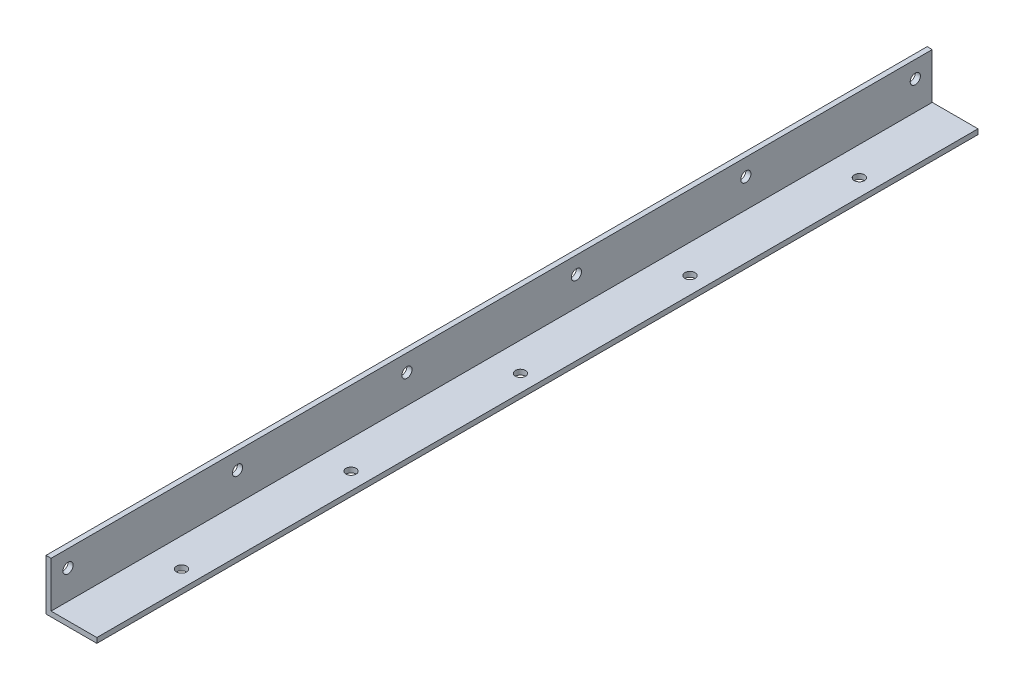
ISO-10303-21;
HEADER;
FILE_DESCRIPTION(('STEP AP214'),'2;1');
FILE_NAME('part.step','',(''),(''),'','','');
FILE_SCHEMA(('AUTOMOTIVE_DESIGN { 1 0 10303 214 1 1 1 1 }'));
ENDSEC;
DATA;
#1=APPLICATION_CONTEXT('core data for automotive mechanical design processes');
#2=APPLICATION_PROTOCOL_DEFINITION('international standard','automotive_design',2000,#1);
#3=PRODUCT_CONTEXT('',#1,'mechanical');
#4=PRODUCT('Part','Part','',(#3));
#5=PRODUCT_RELATED_PRODUCT_CATEGORY('part','',(#4));
#6=PRODUCT_DEFINITION_FORMATION('','',#4);
#7=PRODUCT_DEFINITION_CONTEXT('part definition',#1,'design');
#8=PRODUCT_DEFINITION('design','',#6,#7);
#9=PRODUCT_DEFINITION_SHAPE('','',#8);
#10=(LENGTH_UNIT() NAMED_UNIT(*) SI_UNIT(.MILLI.,.METRE.));
#11=(NAMED_UNIT(*) PLANE_ANGLE_UNIT() SI_UNIT($,.RADIAN.));
#12=(NAMED_UNIT(*) SI_UNIT($,.STERADIAN.) SOLID_ANGLE_UNIT());
#13=UNCERTAINTY_MEASURE_WITH_UNIT(LENGTH_MEASURE(1.E-05),#10,'distance_accuracy_value','');
#14=(GEOMETRIC_REPRESENTATION_CONTEXT(3) GLOBAL_UNCERTAINTY_ASSIGNED_CONTEXT((#13)) GLOBAL_UNIT_ASSIGNED_CONTEXT((#10,
#11,#12)) REPRESENTATION_CONTEXT('',''));
#15=CARTESIAN_POINT('',(0.,0.,0.));
#16=DIRECTION('',(0.,0.,1.));
#17=DIRECTION('',(1.,0.,0.));
#18=AXIS2_PLACEMENT_3D('',#15,#16,#17);
#19=CARTESIAN_POINT('',(0.,0.,260.));
#20=DIRECTION('',(1.,0.,0.));
#21=DIRECTION('',(0.,0.,-1.));
#22=AXIS2_PLACEMENT_3D('',#19,#20,#21);
#23=PLANE('',#22);
#24=CARTESIAN_POINT('',(0.,10.,55.));
#25=DIRECTION('',(-1.,0.,0.));
#26=DIRECTION('',(0.,0.,1.));
#27=AXIS2_PLACEMENT_3D('',#24,#25,#26);
#28=CIRCLE('',#27,1.5);
#29=CARTESIAN_POINT('',(0.,10.,56.5));
#30=VERTEX_POINT('',#29);
#31=EDGE_CURVE('E170',#30,#30,#28,.T.);
#32=ORIENTED_EDGE('',*,*,#31,.F.);
#33=EDGE_LOOP('',(#32));
#34=FACE_BOUND('',#33,.T.);
#35=CARTESIAN_POINT('',(0.,10.,5.));
#36=DIRECTION('',(-1.,0.,0.));
#37=DIRECTION('',(0.,0.,1.));
#38=AXIS2_PLACEMENT_3D('',#35,#36,#37);
#39=CIRCLE('',#38,1.5);
#40=CARTESIAN_POINT('',(0.,10.,6.5));
#41=VERTEX_POINT('',#40);
#42=EDGE_CURVE('E142',#41,#41,#39,.T.);
#43=ORIENTED_EDGE('',*,*,#42,.F.);
#44=EDGE_LOOP('',(#43));
#45=FACE_BOUND('',#44,.T.);
#46=DIRECTION('',(0.,-1.,0.));
#47=VECTOR('',#46,1.);
#48=CARTESIAN_POINT('',(0.,0.,0.));
#49=LINE('',#48,#47);
#50=CARTESIAN_POINT('',(0.,15.,0.));
#51=VERTEX_POINT('',#50);
#52=CARTESIAN_POINT('',(0.,0.,0.));
#53=VERTEX_POINT('',#52);
#54=EDGE_CURVE('E119',#51,#53,#49,.T.);
#55=ORIENTED_EDGE('',*,*,#54,.T.);
#56=DIRECTION('',(0.,0.,-1.));
#57=VECTOR('',#56,1.);
#58=CARTESIAN_POINT('',(0.,0.,260.));
#59=LINE('',#58,#57);
#60=CARTESIAN_POINT('',(0.,0.,260.));
#61=VERTEX_POINT('',#60);
#62=EDGE_CURVE('E137',#61,#53,#59,.T.);
#63=ORIENTED_EDGE('',*,*,#62,.F.);
#64=DIRECTION('',(0.,-1.,0.));
#65=VECTOR('',#64,1.);
#66=CARTESIAN_POINT('',(0.,0.,260.));
#67=LINE('',#66,#65);
#68=CARTESIAN_POINT('',(0.,15.,260.));
#69=VERTEX_POINT('',#68);
#70=EDGE_CURVE('E130',#69,#61,#67,.T.);
#71=ORIENTED_EDGE('',*,*,#70,.F.);
#72=DIRECTION('',(0.,0.,-1.));
#73=VECTOR('',#72,1.);
#74=CARTESIAN_POINT('',(0.,15.,260.));
#75=LINE('',#74,#73);
#76=EDGE_CURVE('E115',#69,#51,#75,.T.);
#77=ORIENTED_EDGE('',*,*,#76,.T.);
#78=EDGE_LOOP('',(#55,#63,#71,#77));
#79=FACE_BOUND('',#78,.T.);
#80=CARTESIAN_POINT('',(0.,10.,105.));
#81=DIRECTION('',(-1.,0.,0.));
#82=DIRECTION('',(0.,0.,1.));
#83=AXIS2_PLACEMENT_3D('',#80,#81,#82);
#84=CIRCLE('',#83,1.5);
#85=CARTESIAN_POINT('',(0.,10.,106.5));
#86=VERTEX_POINT('',#85);
#87=EDGE_CURVE('E139',#86,#86,#84,.T.);
#88=ORIENTED_EDGE('',*,*,#87,.F.);
#89=EDGE_LOOP('',(#88));
#90=FACE_BOUND('',#89,.T.);
#91=CARTESIAN_POINT('',(0.,10.,155.));
#92=DIRECTION('',(-1.,0.,0.));
#93=DIRECTION('',(0.,0.,1.));
#94=AXIS2_PLACEMENT_3D('',#91,#92,#93);
#95=CIRCLE('',#94,1.5);
#96=CARTESIAN_POINT('',(0.,10.,156.5));
#97=VERTEX_POINT('',#96);
#98=EDGE_CURVE('E148',#97,#97,#95,.T.);
#99=ORIENTED_EDGE('',*,*,#98,.F.);
#100=EDGE_LOOP('',(#99));
#101=FACE_BOUND('',#100,.T.);
#102=CARTESIAN_POINT('',(0.,10.,205.));
#103=DIRECTION('',(-1.,0.,0.));
#104=DIRECTION('',(0.,0.,1.));
#105=AXIS2_PLACEMENT_3D('',#102,#103,#104);
#106=CIRCLE('',#105,1.5);
#107=CARTESIAN_POINT('',(0.,10.,206.5));
#108=VERTEX_POINT('',#107);
#109=EDGE_CURVE('E154',#108,#108,#106,.T.);
#110=ORIENTED_EDGE('',*,*,#109,.F.);
#111=EDGE_LOOP('',(#110));
#112=FACE_BOUND('',#111,.T.);
#113=CARTESIAN_POINT('',(0.,10.,255.));
#114=DIRECTION('',(-1.,0.,0.));
#115=DIRECTION('',(0.,0.,1.));
#116=AXIS2_PLACEMENT_3D('',#113,#114,#115);
#117=CIRCLE('',#116,1.5);
#118=CARTESIAN_POINT('',(0.,10.,256.5));
#119=VERTEX_POINT('',#118);
#120=EDGE_CURVE('E160',#119,#119,#117,.T.);
#121=ORIENTED_EDGE('',*,*,#120,.F.);
#122=EDGE_LOOP('',(#121));
#123=FACE_BOUND('',#122,.T.);
#124=ADVANCED_FACE('F31',(#34,#45,#79,#90,#101,#112,#123),#23,.F.);
#125=CARTESIAN_POINT('',(1.5,0.,260.));
#126=DIRECTION('',(0.,1.,0.));
#127=DIRECTION('',(0.,0.,1.));
#128=AXIS2_PLACEMENT_3D('',#125,#126,#127);
#129=PLANE('',#128);
#130=CARTESIAN_POINT('',(10.,0.,80.));
#131=DIRECTION('',(0.,-1.,0.));
#132=DIRECTION('',(0.,0.,-1.));
#133=AXIS2_PLACEMENT_3D('',#130,#131,#132);
#134=CIRCLE('',#133,1.5);
#135=CARTESIAN_POINT('',(10.,0.,78.5));
#136=VERTEX_POINT('',#135);
#137=EDGE_CURVE('E273',#136,#136,#134,.T.);
#138=ORIENTED_EDGE('',*,*,#137,.F.);
#139=EDGE_LOOP('',(#138));
#140=FACE_BOUND('',#139,.T.);
#141=CARTESIAN_POINT('',(10.,0.,30.));
#142=DIRECTION('',(0.,-1.,0.));
#143=DIRECTION('',(0.,0.,-1.));
#144=AXIS2_PLACEMENT_3D('',#141,#142,#143);
#145=CIRCLE('',#144,1.5);
#146=CARTESIAN_POINT('',(10.,0.,28.5));
#147=VERTEX_POINT('',#146);
#148=EDGE_CURVE('E171',#147,#147,#145,.T.);
#149=ORIENTED_EDGE('',*,*,#148,.F.);
#150=EDGE_LOOP('',(#149));
#151=FACE_BOUND('',#150,.T.);
#152=DIRECTION('',(1.,0.,0.));
#153=VECTOR('',#152,1.);
#154=CARTESIAN_POINT('',(1.5,0.,0.));
#155=LINE('',#154,#153);
#156=CARTESIAN_POINT('',(15.,0.,0.));
#157=VERTEX_POINT('',#156);
#158=EDGE_CURVE('E122',#53,#157,#155,.T.);
#159=ORIENTED_EDGE('',*,*,#158,.T.);
#160=DIRECTION('',(0.,0.,-1.));
#161=VECTOR('',#160,1.);
#162=CARTESIAN_POINT('',(15.,0.,260.));
#163=LINE('',#162,#161);
#164=CARTESIAN_POINT('',(15.,0.,260.));
#165=VERTEX_POINT('',#164);
#166=EDGE_CURVE('E134',#165,#157,#163,.T.);
#167=ORIENTED_EDGE('',*,*,#166,.F.);
#168=DIRECTION('',(1.,0.,0.));
#169=VECTOR('',#168,1.);
#170=CARTESIAN_POINT('',(0.,0.,260.));
#171=LINE('',#170,#169);
#172=EDGE_CURVE('E86',#61,#165,#171,.T.);
#173=ORIENTED_EDGE('',*,*,#172,.F.);
#174=ORIENTED_EDGE('',*,*,#62,.T.);
#175=EDGE_LOOP('',(#159,#167,#173,#174));
#176=FACE_BOUND('',#175,.T.);
#177=CARTESIAN_POINT('',(10.,0.,130.));
#178=DIRECTION('',(0.,-1.,0.));
#179=DIRECTION('',(0.,0.,-1.));
#180=AXIS2_PLACEMENT_3D('',#177,#178,#179);
#181=CIRCLE('',#180,1.5);
#182=CARTESIAN_POINT('',(10.,0.,128.5));
#183=VERTEX_POINT('',#182);
#184=EDGE_CURVE('E166',#183,#183,#181,.T.);
#185=ORIENTED_EDGE('',*,*,#184,.F.);
#186=EDGE_LOOP('',(#185));
#187=FACE_BOUND('',#186,.T.);
#188=CARTESIAN_POINT('',(10.,0.,180.));
#189=DIRECTION('',(0.,-1.,0.));
#190=DIRECTION('',(0.,0.,-1.));
#191=AXIS2_PLACEMENT_3D('',#188,#189,#190);
#192=CIRCLE('',#191,1.5);
#193=CARTESIAN_POINT('',(10.,0.,178.5));
#194=VERTEX_POINT('',#193);
#195=EDGE_CURVE('E177',#194,#194,#192,.T.);
#196=ORIENTED_EDGE('',*,*,#195,.F.);
#197=EDGE_LOOP('',(#196));
#198=FACE_BOUND('',#197,.T.);
#199=CARTESIAN_POINT('',(10.,0.,230.));
#200=DIRECTION('',(0.,-1.,0.));
#201=DIRECTION('',(0.,0.,-1.));
#202=AXIS2_PLACEMENT_3D('',#199,#200,#201);
#203=CIRCLE('',#202,1.5);
#204=CARTESIAN_POINT('',(10.,0.,228.5));
#205=VERTEX_POINT('',#204);
#206=EDGE_CURVE('E40',#205,#205,#203,.T.);
#207=ORIENTED_EDGE('',*,*,#206,.F.);
#208=EDGE_LOOP('',(#207));
#209=FACE_BOUND('',#208,.T.);
#210=ADVANCED_FACE('F187',(#140,#151,#176,#187,#198,#209),#129,.F.);
#211=CARTESIAN_POINT('',(15.,0.,260.));
#212=DIRECTION('',(-1.,0.,0.));
#213=DIRECTION('',(0.,0.,1.));
#214=AXIS2_PLACEMENT_3D('',#211,#212,#213);
#215=PLANE('',#214);
#216=DIRECTION('',(0.,1.,0.));
#217=VECTOR('',#216,1.);
#218=CARTESIAN_POINT('',(15.,0.,0.));
#219=LINE('',#218,#217);
#220=CARTESIAN_POINT('',(15.,1.5,0.));
#221=VERTEX_POINT('',#220);
#222=EDGE_CURVE('E125',#157,#221,#219,.T.);
#223=ORIENTED_EDGE('',*,*,#222,.T.);
#224=DIRECTION('',(0.,0.,-1.));
#225=VECTOR('',#224,1.);
#226=CARTESIAN_POINT('',(15.,1.5,260.));
#227=LINE('',#226,#225);
#228=CARTESIAN_POINT('',(15.,1.5,260.));
#229=VERTEX_POINT('',#228);
#230=EDGE_CURVE('E109',#229,#221,#227,.T.);
#231=ORIENTED_EDGE('',*,*,#230,.F.);
#232=DIRECTION('',(0.,1.,0.));
#233=VECTOR('',#232,1.);
#234=CARTESIAN_POINT('',(15.,0.,260.));
#235=LINE('',#234,#233);
#236=EDGE_CURVE('E99',#165,#229,#235,.T.);
#237=ORIENTED_EDGE('',*,*,#236,.F.);
#238=ORIENTED_EDGE('',*,*,#166,.T.);
#239=EDGE_LOOP('',(#223,#231,#237,#238));
#240=FACE_BOUND('',#239,.T.);
#241=ADVANCED_FACE('F189',(#240),#215,.F.);
#242=CARTESIAN_POINT('',(1.5,1.5,260.));
#243=DIRECTION('',(0.,-1.,0.));
#244=DIRECTION('',(0.,0.,-1.));
#245=AXIS2_PLACEMENT_3D('',#242,#243,#244);
#246=PLANE('',#245);
#247=CARTESIAN_POINT('',(10.,1.5,80.));
#248=DIRECTION('',(0.,-1.,0.));
#249=DIRECTION('',(0.,0.,-1.));
#250=AXIS2_PLACEMENT_3D('',#247,#248,#249);
#251=CIRCLE('',#250,1.5);
#252=CARTESIAN_POINT('',(10.,1.5,78.5));
#253=VERTEX_POINT('',#252);
#254=EDGE_CURVE('E275',#253,#253,#251,.T.);
#255=ORIENTED_EDGE('',*,*,#254,.T.);
#256=EDGE_LOOP('',(#255));
#257=FACE_BOUND('',#256,.T.);
#258=CARTESIAN_POINT('',(10.,1.5,30.));
#259=DIRECTION('',(0.,-1.,0.));
#260=DIRECTION('',(0.,0.,-1.));
#261=AXIS2_PLACEMENT_3D('',#258,#259,#260);
#262=CIRCLE('',#261,1.5);
#263=CARTESIAN_POINT('',(10.,1.5,28.5));
#264=VERTEX_POINT('',#263);
#265=EDGE_CURVE('E167',#264,#264,#262,.T.);
#266=ORIENTED_EDGE('',*,*,#265,.T.);
#267=EDGE_LOOP('',(#266));
#268=FACE_BOUND('',#267,.T.);
#269=DIRECTION('',(-1.,0.,0.));
#270=VECTOR('',#269,1.);
#271=CARTESIAN_POINT('',(1.5,1.5,0.));
#272=LINE('',#271,#270);
#273=CARTESIAN_POINT('',(1.5,1.5,0.));
#274=VERTEX_POINT('',#273);
#275=EDGE_CURVE('E108',#221,#274,#272,.T.);
#276=ORIENTED_EDGE('',*,*,#275,.T.);
#277=DIRECTION('',(0.,0.,-1.));
#278=VECTOR('',#277,1.);
#279=CARTESIAN_POINT('',(1.5,1.5,260.));
#280=LINE('',#279,#278);
#281=CARTESIAN_POINT('',(1.5,1.5,260.));
#282=VERTEX_POINT('',#281);
#283=EDGE_CURVE('E104',#282,#274,#280,.T.);
#284=ORIENTED_EDGE('',*,*,#283,.F.);
#285=DIRECTION('',(-1.,0.,0.));
#286=VECTOR('',#285,1.);
#287=CARTESIAN_POINT('',(1.5,1.5,260.));
#288=LINE('',#287,#286);
#289=EDGE_CURVE('E93',#229,#282,#288,.T.);
#290=ORIENTED_EDGE('',*,*,#289,.F.);
#291=ORIENTED_EDGE('',*,*,#230,.T.);
#292=EDGE_LOOP('',(#276,#284,#290,#291));
#293=FACE_BOUND('',#292,.T.);
#294=CARTESIAN_POINT('',(10.,1.5,130.));
#295=DIRECTION('',(0.,-1.,0.));
#296=DIRECTION('',(0.,0.,-1.));
#297=AXIS2_PLACEMENT_3D('',#294,#295,#296);
#298=CIRCLE('',#297,1.5);
#299=CARTESIAN_POINT('',(10.,1.5,128.5));
#300=VERTEX_POINT('',#299);
#301=EDGE_CURVE('E174',#300,#300,#298,.T.);
#302=ORIENTED_EDGE('',*,*,#301,.T.);
#303=EDGE_LOOP('',(#302));
#304=FACE_BOUND('',#303,.T.);
#305=CARTESIAN_POINT('',(10.,1.5,180.));
#306=DIRECTION('',(0.,-1.,0.));
#307=DIRECTION('',(0.,0.,-1.));
#308=AXIS2_PLACEMENT_3D('',#305,#306,#307);
#309=CIRCLE('',#308,1.5);
#310=CARTESIAN_POINT('',(10.,1.5,178.5));
#311=VERTEX_POINT('',#310);
#312=EDGE_CURVE('E180',#311,#311,#309,.T.);
#313=ORIENTED_EDGE('',*,*,#312,.T.);
#314=EDGE_LOOP('',(#313));
#315=FACE_BOUND('',#314,.T.);
#316=CARTESIAN_POINT('',(10.,1.5,230.));
#317=DIRECTION('',(0.,-1.,0.));
#318=DIRECTION('',(0.,0.,-1.));
#319=AXIS2_PLACEMENT_3D('',#316,#317,#318);
#320=CIRCLE('',#319,1.5);
#321=CARTESIAN_POINT('',(10.,1.5,228.5));
#322=VERTEX_POINT('',#321);
#323=EDGE_CURVE('E11',#322,#322,#320,.T.);
#324=ORIENTED_EDGE('',*,*,#323,.T.);
#325=EDGE_LOOP('',(#324));
#326=FACE_BOUND('',#325,.T.);
#327=ADVANCED_FACE('F105',(#257,#268,#293,#304,#315,#326),#246,.F.);
#328=CARTESIAN_POINT('',(1.5,1.5,260.));
#329=DIRECTION('',(-1.,0.,0.));
#330=DIRECTION('',(0.,0.,1.));
#331=AXIS2_PLACEMENT_3D('',#328,#329,#330);
#332=PLANE('',#331);
#333=CARTESIAN_POINT('',(1.5,10.,55.));
#334=DIRECTION('',(-1.,0.,0.));
#335=DIRECTION('',(0.,0.,1.));
#336=AXIS2_PLACEMENT_3D('',#333,#334,#335);
#337=CIRCLE('',#336,1.5);
#338=CARTESIAN_POINT('',(1.5,10.,56.5));
#339=VERTEX_POINT('',#338);
#340=EDGE_CURVE('E283',#339,#339,#337,.T.);
#341=ORIENTED_EDGE('',*,*,#340,.T.);
#342=EDGE_LOOP('',(#341));
#343=FACE_BOUND('',#342,.T.);
#344=CARTESIAN_POINT('',(1.5,10.,5.));
#345=DIRECTION('',(-1.,0.,0.));
#346=DIRECTION('',(0.,0.,1.));
#347=AXIS2_PLACEMENT_3D('',#344,#345,#346);
#348=CIRCLE('',#347,1.5);
#349=CARTESIAN_POINT('',(1.5,10.,6.5));
#350=VERTEX_POINT('',#349);
#351=EDGE_CURVE('E123',#350,#350,#348,.T.);
#352=ORIENTED_EDGE('',*,*,#351,.T.);
#353=EDGE_LOOP('',(#352));
#354=FACE_BOUND('',#353,.T.);
#355=DIRECTION('',(0.,1.,0.));
#356=VECTOR('',#355,1.);
#357=CARTESIAN_POINT('',(1.5,1.5,0.));
#358=LINE('',#357,#356);
#359=CARTESIAN_POINT('',(1.5,15.,0.));
#360=VERTEX_POINT('',#359);
#361=EDGE_CURVE('E71',#274,#360,#358,.T.);
#362=ORIENTED_EDGE('',*,*,#361,.T.);
#363=DIRECTION('',(0.,0.,-1.));
#364=VECTOR('',#363,1.);
#365=CARTESIAN_POINT('',(1.5,15.,260.));
#366=LINE('',#365,#364);
#367=CARTESIAN_POINT('',(1.5,15.,260.));
#368=VERTEX_POINT('',#367);
#369=EDGE_CURVE('E110',#368,#360,#366,.T.);
#370=ORIENTED_EDGE('',*,*,#369,.F.);
#371=DIRECTION('',(0.,1.,0.));
#372=VECTOR('',#371,1.);
#373=CARTESIAN_POINT('',(1.5,1.5,260.));
#374=LINE('',#373,#372);
#375=EDGE_CURVE('E97',#282,#368,#374,.T.);
#376=ORIENTED_EDGE('',*,*,#375,.F.);
#377=ORIENTED_EDGE('',*,*,#283,.T.);
#378=EDGE_LOOP('',(#362,#370,#376,#377));
#379=FACE_BOUND('',#378,.T.);
#380=CARTESIAN_POINT('',(1.5,10.,105.));
#381=DIRECTION('',(-1.,0.,0.));
#382=DIRECTION('',(0.,0.,1.));
#383=AXIS2_PLACEMENT_3D('',#380,#381,#382);
#384=CIRCLE('',#383,1.5);
#385=CARTESIAN_POINT('',(1.5,10.,106.5));
#386=VERTEX_POINT('',#385);
#387=EDGE_CURVE('E145',#386,#386,#384,.T.);
#388=ORIENTED_EDGE('',*,*,#387,.T.);
#389=EDGE_LOOP('',(#388));
#390=FACE_BOUND('',#389,.T.);
#391=CARTESIAN_POINT('',(1.5,10.,155.));
#392=DIRECTION('',(-1.,0.,0.));
#393=DIRECTION('',(0.,0.,1.));
#394=AXIS2_PLACEMENT_3D('',#391,#392,#393);
#395=CIRCLE('',#394,1.5);
#396=CARTESIAN_POINT('',(1.5,10.,156.5));
#397=VERTEX_POINT('',#396);
#398=EDGE_CURVE('E151',#397,#397,#395,.T.);
#399=ORIENTED_EDGE('',*,*,#398,.T.);
#400=EDGE_LOOP('',(#399));
#401=FACE_BOUND('',#400,.T.);
#402=CARTESIAN_POINT('',(1.5,10.,205.));
#403=DIRECTION('',(-1.,0.,0.));
#404=DIRECTION('',(0.,0.,1.));
#405=AXIS2_PLACEMENT_3D('',#402,#403,#404);
#406=CIRCLE('',#405,1.5);
#407=CARTESIAN_POINT('',(1.5,10.,206.5));
#408=VERTEX_POINT('',#407);
#409=EDGE_CURVE('E157',#408,#408,#406,.T.);
#410=ORIENTED_EDGE('',*,*,#409,.T.);
#411=EDGE_LOOP('',(#410));
#412=FACE_BOUND('',#411,.T.);
#413=CARTESIAN_POINT('',(1.5,10.,255.));
#414=DIRECTION('',(-1.,0.,0.));
#415=DIRECTION('',(0.,0.,1.));
#416=AXIS2_PLACEMENT_3D('',#413,#414,#415);
#417=CIRCLE('',#416,1.5);
#418=CARTESIAN_POINT('',(1.5,10.,256.5));
#419=VERTEX_POINT('',#418);
#420=EDGE_CURVE('E163',#419,#419,#417,.T.);
#421=ORIENTED_EDGE('',*,*,#420,.T.);
#422=EDGE_LOOP('',(#421));
#423=FACE_BOUND('',#422,.T.);
#424=ADVANCED_FACE('F112',(#343,#354,#379,#390,#401,#412,#423),#332,.F.);
#425=CARTESIAN_POINT('',(0.,15.,260.));
#426=DIRECTION('',(0.,-1.,0.));
#427=DIRECTION('',(0.,0.,-1.));
#428=AXIS2_PLACEMENT_3D('',#425,#426,#427);
#429=PLANE('',#428);
#430=DIRECTION('',(-1.,0.,0.));
#431=VECTOR('',#430,1.);
#432=CARTESIAN_POINT('',(0.,15.,0.));
#433=LINE('',#432,#431);
#434=EDGE_CURVE('E77',#360,#51,#433,.T.);
#435=ORIENTED_EDGE('',*,*,#434,.T.);
#436=ORIENTED_EDGE('',*,*,#76,.F.);
#437=DIRECTION('',(-1.,0.,0.));
#438=VECTOR('',#437,1.);
#439=CARTESIAN_POINT('',(0.,15.,260.));
#440=LINE('',#439,#438);
#441=EDGE_CURVE('E48',#368,#69,#440,.T.);
#442=ORIENTED_EDGE('',*,*,#441,.F.);
#443=ORIENTED_EDGE('',*,*,#369,.T.);
#444=EDGE_LOOP('',(#435,#436,#442,#443));
#445=FACE_BOUND('',#444,.T.);
#446=ADVANCED_FACE('F243',(#445),#429,.F.);
#447=CARTESIAN_POINT('',(0.,15.,260.));
#448=DIRECTION('',(0.,0.,-1.));
#449=DIRECTION('',(-1.,0.,0.));
#450=AXIS2_PLACEMENT_3D('',#447,#448,#449);
#451=PLANE('',#450);
#452=ORIENTED_EDGE('',*,*,#70,.T.);
#453=ORIENTED_EDGE('',*,*,#172,.T.);
#454=ORIENTED_EDGE('',*,*,#236,.T.);
#455=ORIENTED_EDGE('',*,*,#289,.T.);
#456=ORIENTED_EDGE('',*,*,#375,.T.);
#457=ORIENTED_EDGE('',*,*,#441,.T.);
#458=EDGE_LOOP('',(#452,#453,#454,#455,#456,#457));
#459=FACE_BOUND('',#458,.T.);
#460=ADVANCED_FACE('F95',(#459),#451,.F.);
#461=CARTESIAN_POINT('',(0.,15.,0.));
#462=DIRECTION('',(0.,0.,-1.));
#463=DIRECTION('',(-1.,0.,0.));
#464=AXIS2_PLACEMENT_3D('',#461,#462,#463);
#465=PLANE('',#464);
#466=ORIENTED_EDGE('',*,*,#54,.F.);
#467=ORIENTED_EDGE('',*,*,#434,.F.);
#468=ORIENTED_EDGE('',*,*,#361,.F.);
#469=ORIENTED_EDGE('',*,*,#275,.F.);
#470=ORIENTED_EDGE('',*,*,#222,.F.);
#471=ORIENTED_EDGE('',*,*,#158,.F.);
#472=EDGE_LOOP('',(#466,#467,#468,#469,#470,#471));
#473=FACE_BOUND('',#472,.T.);
#474=ADVANCED_FACE('F251',(#473),#465,.T.);
#475=CARTESIAN_POINT('',(15.,10.,5.));
#476=DIRECTION('',(-1.,0.,0.));
#477=DIRECTION('',(0.,0.,1.));
#478=AXIS2_PLACEMENT_3D('',#475,#476,#477);
#479=CYLINDRICAL_SURFACE('',#478,1.5);
#480=ORIENTED_EDGE('',*,*,#42,.T.);
#481=EDGE_LOOP('',(#480));
#482=FACE_BOUND('',#481,.T.);
#483=ORIENTED_EDGE('',*,*,#351,.F.);
#484=EDGE_LOOP('',(#483));
#485=FACE_BOUND('',#484,.T.);
#486=ADVANCED_FACE('F254',(#482,#485),#479,.F.);
#487=CARTESIAN_POINT('',(15.,10.,55.));
#488=DIRECTION('',(-1.,0.,0.));
#489=DIRECTION('',(0.,0.,1.));
#490=AXIS2_PLACEMENT_3D('',#487,#488,#489);
#491=CYLINDRICAL_SURFACE('',#490,1.5);
#492=ORIENTED_EDGE('',*,*,#31,.T.);
#493=EDGE_LOOP('',(#492));
#494=FACE_BOUND('',#493,.T.);
#495=ORIENTED_EDGE('',*,*,#340,.F.);
#496=EDGE_LOOP('',(#495));
#497=FACE_BOUND('',#496,.T.);
#498=ADVANCED_FACE('F208',(#494,#497),#491,.F.);
#499=CARTESIAN_POINT('',(15.,10.,105.));
#500=DIRECTION('',(-1.,0.,0.));
#501=DIRECTION('',(0.,0.,1.));
#502=AXIS2_PLACEMENT_3D('',#499,#500,#501);
#503=CYLINDRICAL_SURFACE('',#502,1.5);
#504=ORIENTED_EDGE('',*,*,#87,.T.);
#505=EDGE_LOOP('',(#504));
#506=FACE_BOUND('',#505,.T.);
#507=ORIENTED_EDGE('',*,*,#387,.F.);
#508=EDGE_LOOP('',(#507));
#509=FACE_BOUND('',#508,.T.);
#510=ADVANCED_FACE('F204',(#506,#509),#503,.F.);
#511=CARTESIAN_POINT('',(15.,10.,155.));
#512=DIRECTION('',(-1.,0.,0.));
#513=DIRECTION('',(0.,0.,1.));
#514=AXIS2_PLACEMENT_3D('',#511,#512,#513);
#515=CYLINDRICAL_SURFACE('',#514,1.5);
#516=ORIENTED_EDGE('',*,*,#98,.T.);
#517=EDGE_LOOP('',(#516));
#518=FACE_BOUND('',#517,.T.);
#519=ORIENTED_EDGE('',*,*,#398,.F.);
#520=EDGE_LOOP('',(#519));
#521=FACE_BOUND('',#520,.T.);
#522=ADVANCED_FACE('F207',(#518,#521),#515,.F.);
#523=CARTESIAN_POINT('',(15.,10.,205.));
#524=DIRECTION('',(-1.,0.,0.));
#525=DIRECTION('',(0.,0.,1.));
#526=AXIS2_PLACEMENT_3D('',#523,#524,#525);
#527=CYLINDRICAL_SURFACE('',#526,1.5);
#528=ORIENTED_EDGE('',*,*,#109,.T.);
#529=EDGE_LOOP('',(#528));
#530=FACE_BOUND('',#529,.T.);
#531=ORIENTED_EDGE('',*,*,#409,.F.);
#532=EDGE_LOOP('',(#531));
#533=FACE_BOUND('',#532,.T.);
#534=ADVANCED_FACE('F212',(#530,#533),#527,.F.);
#535=CARTESIAN_POINT('',(15.,10.,255.));
#536=DIRECTION('',(-1.,0.,0.));
#537=DIRECTION('',(0.,0.,1.));
#538=AXIS2_PLACEMENT_3D('',#535,#536,#537);
#539=CYLINDRICAL_SURFACE('',#538,1.5);
#540=ORIENTED_EDGE('',*,*,#120,.T.);
#541=EDGE_LOOP('',(#540));
#542=FACE_BOUND('',#541,.T.);
#543=ORIENTED_EDGE('',*,*,#420,.F.);
#544=EDGE_LOOP('',(#543));
#545=FACE_BOUND('',#544,.T.);
#546=ADVANCED_FACE('F216',(#542,#545),#539,.F.);
#547=CARTESIAN_POINT('',(10.,15.,30.));
#548=DIRECTION('',(0.,-1.,0.));
#549=DIRECTION('',(0.,0.,-1.));
#550=AXIS2_PLACEMENT_3D('',#547,#548,#549);
#551=CYLINDRICAL_SURFACE('',#550,1.5);
#552=ORIENTED_EDGE('',*,*,#148,.T.);
#553=EDGE_LOOP('',(#552));
#554=FACE_BOUND('',#553,.T.);
#555=ORIENTED_EDGE('',*,*,#265,.F.);
#556=EDGE_LOOP('',(#555));
#557=FACE_BOUND('',#556,.T.);
#558=ADVANCED_FACE('F220',(#554,#557),#551,.F.);
#559=CARTESIAN_POINT('',(10.,15.,80.));
#560=DIRECTION('',(0.,-1.,0.));
#561=DIRECTION('',(0.,0.,-1.));
#562=AXIS2_PLACEMENT_3D('',#559,#560,#561);
#563=CYLINDRICAL_SURFACE('',#562,1.5);
#564=ORIENTED_EDGE('',*,*,#137,.T.);
#565=EDGE_LOOP('',(#564));
#566=FACE_BOUND('',#565,.T.);
#567=ORIENTED_EDGE('',*,*,#254,.F.);
#568=EDGE_LOOP('',(#567));
#569=FACE_BOUND('',#568,.T.);
#570=ADVANCED_FACE('F225',(#566,#569),#563,.F.);
#571=CARTESIAN_POINT('',(10.,15.,130.));
#572=DIRECTION('',(0.,-1.,0.));
#573=DIRECTION('',(0.,0.,-1.));
#574=AXIS2_PLACEMENT_3D('',#571,#572,#573);
#575=CYLINDRICAL_SURFACE('',#574,1.5);
#576=ORIENTED_EDGE('',*,*,#184,.T.);
#577=EDGE_LOOP('',(#576));
#578=FACE_BOUND('',#577,.T.);
#579=ORIENTED_EDGE('',*,*,#301,.F.);
#580=EDGE_LOOP('',(#579));
#581=FACE_BOUND('',#580,.T.);
#582=ADVANCED_FACE('F222',(#578,#581),#575,.F.);
#583=CARTESIAN_POINT('',(10.,15.,180.));
#584=DIRECTION('',(0.,-1.,0.));
#585=DIRECTION('',(0.,0.,-1.));
#586=AXIS2_PLACEMENT_3D('',#583,#584,#585);
#587=CYLINDRICAL_SURFACE('',#586,1.5);
#588=ORIENTED_EDGE('',*,*,#195,.T.);
#589=EDGE_LOOP('',(#588));
#590=FACE_BOUND('',#589,.T.);
#591=ORIENTED_EDGE('',*,*,#312,.F.);
#592=EDGE_LOOP('',(#591));
#593=FACE_BOUND('',#592,.T.);
#594=ADVANCED_FACE('F224',(#590,#593),#587,.F.);
#595=CARTESIAN_POINT('',(10.,15.,230.));
#596=DIRECTION('',(0.,-1.,0.));
#597=DIRECTION('',(0.,0.,-1.));
#598=AXIS2_PLACEMENT_3D('',#595,#596,#597);
#599=CYLINDRICAL_SURFACE('',#598,1.5);
#600=ORIENTED_EDGE('',*,*,#206,.T.);
#601=EDGE_LOOP('',(#600));
#602=FACE_BOUND('',#601,.T.);
#603=ORIENTED_EDGE('',*,*,#323,.F.);
#604=EDGE_LOOP('',(#603));
#605=FACE_BOUND('',#604,.T.);
#606=ADVANCED_FACE('F33',(#602,#605),#599,.F.);
#607=CLOSED_SHELL('',(#124,#210,#241,#327,#424,#446,#460,#474,#486,#498,#510,#522,#534,#546,
#558,#570,#582,#594,#606));
#608=MANIFOLD_SOLID_BREP('B2',#607);
#609=ADVANCED_BREP_SHAPE_REPRESENTATION('',(#18,#608),#14);
#610=SHAPE_DEFINITION_REPRESENTATION(#9,#609);
ENDSEC;
END-ISO-10303-21;
